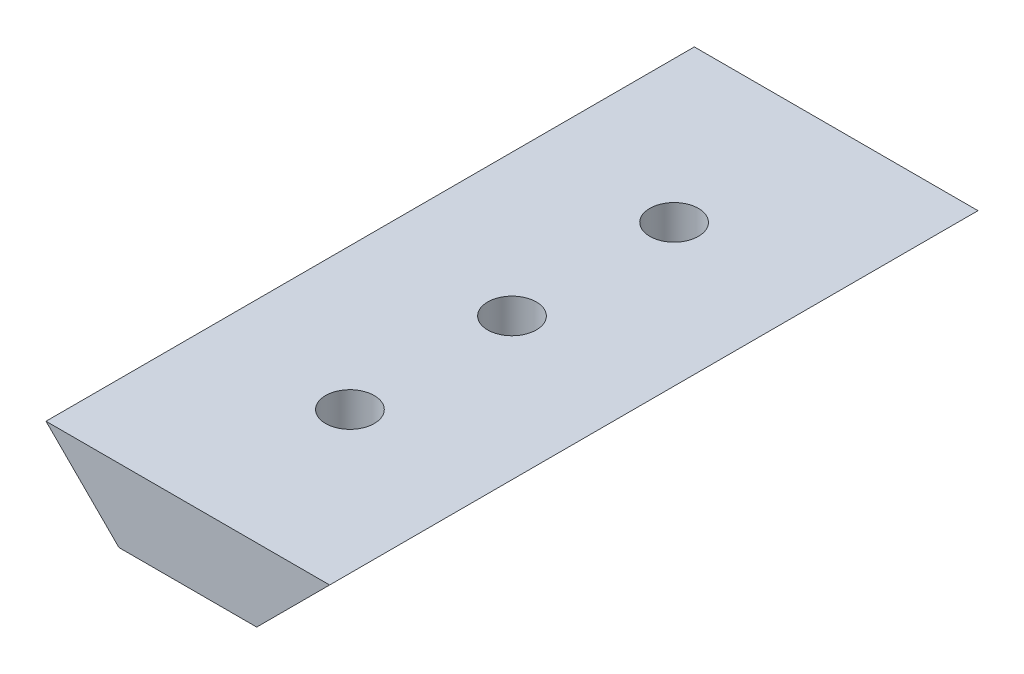
ISO-10303-21;
HEADER;
FILE_DESCRIPTION(('STEP AP214'),'2;1');
FILE_NAME('part.step','',(''),(''),'','','');
FILE_SCHEMA(('AUTOMOTIVE_DESIGN { 1 0 10303 214 1 1 1 1 }'));
ENDSEC;
DATA;
#1=APPLICATION_CONTEXT('core data for automotive mechanical design processes');
#2=APPLICATION_PROTOCOL_DEFINITION('international standard','automotive_design',2000,#1);
#3=PRODUCT_CONTEXT('',#1,'mechanical');
#4=PRODUCT('Part','Part','',(#3));
#5=PRODUCT_RELATED_PRODUCT_CATEGORY('part','',(#4));
#6=PRODUCT_DEFINITION_FORMATION('','',#4);
#7=PRODUCT_DEFINITION_CONTEXT('part definition',#1,'design');
#8=PRODUCT_DEFINITION('design','',#6,#7);
#9=PRODUCT_DEFINITION_SHAPE('','',#8);
#10=(LENGTH_UNIT() NAMED_UNIT(*) SI_UNIT(.MILLI.,.METRE.));
#11=(NAMED_UNIT(*) PLANE_ANGLE_UNIT() SI_UNIT($,.RADIAN.));
#12=(NAMED_UNIT(*) SI_UNIT($,.STERADIAN.) SOLID_ANGLE_UNIT());
#13=UNCERTAINTY_MEASURE_WITH_UNIT(LENGTH_MEASURE(1.E-05),#10,'distance_accuracy_value','');
#14=(GEOMETRIC_REPRESENTATION_CONTEXT(3) GLOBAL_UNCERTAINTY_ASSIGNED_CONTEXT((#13)) GLOBAL_UNIT_ASSIGNED_CONTEXT((#10,
#11,#12)) REPRESENTATION_CONTEXT('',''));
#15=CARTESIAN_POINT('',(0.,0.,0.));
#16=DIRECTION('',(0.,0.,1.));
#17=DIRECTION('',(1.,0.,0.));
#18=AXIS2_PLACEMENT_3D('',#15,#16,#17);
#19=CARTESIAN_POINT('',(-8.75,2.25,40.));
#20=DIRECTION('',(0.707106781186547,0.707106781186548,0.));
#21=DIRECTION('',(-0.707106781186548,0.707106781186547,0.));
#22=AXIS2_PLACEMENT_3D('',#19,#20,#21);
#23=PLANE('',#22);
#24=DIRECTION('',(0.707106781186548,-0.707106781186547,0.));
#25=VECTOR('',#24,1.);
#26=CARTESIAN_POINT('',(-8.75,2.25,0.));
#27=LINE('',#26,#25);
#28=CARTESIAN_POINT('',(-8.75,2.25,0.));
#29=VERTEX_POINT('',#28);
#30=CARTESIAN_POINT('',(-4.25,-2.25,0.));
#31=VERTEX_POINT('',#30);
#32=EDGE_CURVE('E94',#29,#31,#27,.T.);
#33=ORIENTED_EDGE('',*,*,#32,.T.);
#34=DIRECTION('',(0.,0.,-1.));
#35=VECTOR('',#34,1.);
#36=CARTESIAN_POINT('',(-4.25,-2.25,40.));
#37=LINE('',#36,#35);
#38=CARTESIAN_POINT('',(-4.25,-2.25,40.));
#39=VERTEX_POINT('',#38);
#40=EDGE_CURVE('E11',#39,#31,#37,.T.);
#41=ORIENTED_EDGE('',*,*,#40,.F.);
#42=DIRECTION('',(0.707106781186548,-0.707106781186547,0.));
#43=VECTOR('',#42,1.);
#44=CARTESIAN_POINT('',(-8.75,2.25,40.));
#45=LINE('',#44,#43);
#46=CARTESIAN_POINT('',(-8.75,2.25,40.));
#47=VERTEX_POINT('',#46);
#48=EDGE_CURVE('E82',#47,#39,#45,.T.);
#49=ORIENTED_EDGE('',*,*,#48,.F.);
#50=DIRECTION('',(0.,0.,-1.));
#51=VECTOR('',#50,1.);
#52=CARTESIAN_POINT('',(-8.75,2.25,40.));
#53=LINE('',#52,#51);
#54=EDGE_CURVE('E90',#47,#29,#53,.T.);
#55=ORIENTED_EDGE('',*,*,#54,.T.);
#56=EDGE_LOOP('',(#33,#41,#49,#55));
#57=FACE_BOUND('',#56,.T.);
#58=ADVANCED_FACE('F31',(#57),#23,.F.);
#59=CARTESIAN_POINT('',(-4.25,-2.25,40.));
#60=DIRECTION('',(0.,1.,0.));
#61=DIRECTION('',(-1.,0.,0.));
#62=AXIS2_PLACEMENT_3D('',#59,#60,#61);
#63=PLANE('',#62);
#64=CARTESIAN_POINT('',(0.,-2.25,30.));
#65=DIRECTION('',(0.,1.,0.));
#66=DIRECTION('',(-1.,0.,0.));
#67=AXIS2_PLACEMENT_3D('',#64,#65,#66);
#68=CIRCLE('',#67,1.5);
#69=CARTESIAN_POINT('',(-1.5,-2.25,30.));
#70=VERTEX_POINT('',#69);
#71=EDGE_CURVE('E119',#70,#70,#68,.F.);
#72=ORIENTED_EDGE('',*,*,#71,.F.);
#73=EDGE_LOOP('',(#72));
#74=FACE_BOUND('',#73,.T.);
#75=CARTESIAN_POINT('',(0.,-2.25,10.));
#76=DIRECTION('',(0.,1.,0.));
#77=DIRECTION('',(-1.,0.,0.));
#78=AXIS2_PLACEMENT_3D('',#75,#76,#77);
#79=CIRCLE('',#78,1.5);
#80=CARTESIAN_POINT('',(-1.5,-2.25,10.));
#81=VERTEX_POINT('',#80);
#82=EDGE_CURVE('E113',#81,#81,#79,.F.);
#83=ORIENTED_EDGE('',*,*,#82,.F.);
#84=EDGE_LOOP('',(#83));
#85=FACE_BOUND('',#84,.T.);
#86=CARTESIAN_POINT('',(0.,-2.25,20.));
#87=DIRECTION('',(0.,1.,0.));
#88=DIRECTION('',(-1.,0.,0.));
#89=AXIS2_PLACEMENT_3D('',#86,#87,#88);
#90=CIRCLE('',#89,1.5);
#91=CARTESIAN_POINT('',(-1.5,-2.25,20.));
#92=VERTEX_POINT('',#91);
#93=EDGE_CURVE('E97',#92,#92,#90,.F.);
#94=ORIENTED_EDGE('',*,*,#93,.F.);
#95=EDGE_LOOP('',(#94));
#96=FACE_BOUND('',#95,.T.);
#97=DIRECTION('',(1.,0.,0.));
#98=VECTOR('',#97,1.);
#99=CARTESIAN_POINT('',(-4.25,-2.25,0.));
#100=LINE('',#99,#98);
#101=CARTESIAN_POINT('',(4.25,-2.25,0.));
#102=VERTEX_POINT('',#101);
#103=EDGE_CURVE('E86',#31,#102,#100,.T.);
#104=ORIENTED_EDGE('',*,*,#103,.T.);
#105=DIRECTION('',(0.,0.,-1.));
#106=VECTOR('',#105,1.);
#107=CARTESIAN_POINT('',(4.25,-2.25,40.));
#108=LINE('',#107,#106);
#109=CARTESIAN_POINT('',(4.25,-2.25,40.));
#110=VERTEX_POINT('',#109);
#111=EDGE_CURVE('E39',#110,#102,#108,.T.);
#112=ORIENTED_EDGE('',*,*,#111,.F.);
#113=DIRECTION('',(1.,0.,0.));
#114=VECTOR('',#113,1.);
#115=CARTESIAN_POINT('',(-4.25,-2.25,40.));
#116=LINE('',#115,#114);
#117=EDGE_CURVE('E77',#39,#110,#116,.T.);
#118=ORIENTED_EDGE('',*,*,#117,.F.);
#119=ORIENTED_EDGE('',*,*,#40,.T.);
#120=EDGE_LOOP('',(#104,#112,#118,#119));
#121=FACE_BOUND('',#120,.T.);
#122=ADVANCED_FACE('F85',(#74,#85,#96,#121),#63,.F.);
#123=CARTESIAN_POINT('',(8.75,2.24999999999999,40.));
#124=DIRECTION('',(-0.707106781186547,0.707106781186548,0.));
#125=DIRECTION('',(-0.707106781186548,-0.707106781186547,0.));
#126=AXIS2_PLACEMENT_3D('',#123,#124,#125);
#127=PLANE('',#126);
#128=DIRECTION('',(0.707106781186548,0.707106781186547,0.));
#129=VECTOR('',#128,1.);
#130=CARTESIAN_POINT('',(8.75,2.24999999999999,0.));
#131=LINE('',#130,#129);
#132=CARTESIAN_POINT('',(8.75,2.24999999999999,0.));
#133=VERTEX_POINT('',#132);
#134=EDGE_CURVE('E64',#102,#133,#131,.T.);
#135=ORIENTED_EDGE('',*,*,#134,.T.);
#136=DIRECTION('',(0.,0.,-1.));
#137=VECTOR('',#136,1.);
#138=CARTESIAN_POINT('',(8.75,2.24999999999999,40.));
#139=LINE('',#138,#137);
#140=CARTESIAN_POINT('',(8.75,2.24999999999999,40.));
#141=VERTEX_POINT('',#140);
#142=EDGE_CURVE('E87',#141,#133,#139,.T.);
#143=ORIENTED_EDGE('',*,*,#142,.F.);
#144=DIRECTION('',(0.707106781186548,0.707106781186547,0.));
#145=VECTOR('',#144,1.);
#146=CARTESIAN_POINT('',(8.75,2.24999999999999,40.));
#147=LINE('',#146,#145);
#148=EDGE_CURVE('E80',#110,#141,#147,.T.);
#149=ORIENTED_EDGE('',*,*,#148,.F.);
#150=ORIENTED_EDGE('',*,*,#111,.T.);
#151=EDGE_LOOP('',(#135,#143,#149,#150));
#152=FACE_BOUND('',#151,.T.);
#153=ADVANCED_FACE('F88',(#152),#127,.F.);
#154=CARTESIAN_POINT('',(-8.75,2.25,40.));
#155=DIRECTION('',(0.,-1.,0.));
#156=DIRECTION('',(1.,0.,0.));
#157=AXIS2_PLACEMENT_3D('',#154,#155,#156);
#158=PLANE('',#157);
#159=CARTESIAN_POINT('',(0.,2.25,30.));
#160=DIRECTION('',(0.,1.,0.));
#161=DIRECTION('',(-1.,0.,0.));
#162=AXIS2_PLACEMENT_3D('',#159,#160,#161);
#163=CIRCLE('',#162,1.5);
#164=CARTESIAN_POINT('',(-1.5,2.25,30.));
#165=VERTEX_POINT('',#164);
#166=EDGE_CURVE('E122',#165,#165,#163,.T.);
#167=ORIENTED_EDGE('',*,*,#166,.F.);
#168=EDGE_LOOP('',(#167));
#169=FACE_BOUND('',#168,.T.);
#170=CARTESIAN_POINT('',(0.,2.25,10.));
#171=DIRECTION('',(0.,1.,0.));
#172=DIRECTION('',(-1.,0.,0.));
#173=AXIS2_PLACEMENT_3D('',#170,#171,#172);
#174=CIRCLE('',#173,1.5);
#175=CARTESIAN_POINT('',(-1.5,2.25,10.));
#176=VERTEX_POINT('',#175);
#177=EDGE_CURVE('E116',#176,#176,#174,.T.);
#178=ORIENTED_EDGE('',*,*,#177,.F.);
#179=EDGE_LOOP('',(#178));
#180=FACE_BOUND('',#179,.T.);
#181=CARTESIAN_POINT('',(0.,2.25,20.));
#182=DIRECTION('',(0.,1.,0.));
#183=DIRECTION('',(-1.,0.,0.));
#184=AXIS2_PLACEMENT_3D('',#181,#182,#183);
#185=CIRCLE('',#184,1.5);
#186=CARTESIAN_POINT('',(-1.5,2.25,20.));
#187=VERTEX_POINT('',#186);
#188=EDGE_CURVE('E110',#187,#187,#185,.T.);
#189=ORIENTED_EDGE('',*,*,#188,.F.);
#190=EDGE_LOOP('',(#189));
#191=FACE_BOUND('',#190,.T.);
#192=DIRECTION('',(-1.,0.,0.));
#193=VECTOR('',#192,1.);
#194=CARTESIAN_POINT('',(-8.75,2.25,0.));
#195=LINE('',#194,#193);
#196=EDGE_CURVE('E70',#133,#29,#195,.T.);
#197=ORIENTED_EDGE('',*,*,#196,.T.);
#198=ORIENTED_EDGE('',*,*,#54,.F.);
#199=DIRECTION('',(-1.,0.,0.));
#200=VECTOR('',#199,1.);
#201=CARTESIAN_POINT('',(-8.75,2.25,40.));
#202=LINE('',#201,#200);
#203=EDGE_CURVE('E47',#141,#47,#202,.T.);
#204=ORIENTED_EDGE('',*,*,#203,.F.);
#205=ORIENTED_EDGE('',*,*,#142,.T.);
#206=EDGE_LOOP('',(#197,#198,#204,#205));
#207=FACE_BOUND('',#206,.T.);
#208=ADVANCED_FACE('F102',(#169,#180,#191,#207),#158,.F.);
#209=CARTESIAN_POINT('',(0.,-6.49999999999999,40.));
#210=DIRECTION('',(0.,0.,-1.));
#211=DIRECTION('',(-1.,0.,0.));
#212=AXIS2_PLACEMENT_3D('',#209,#210,#211);
#213=PLANE('',#212);
#214=ORIENTED_EDGE('',*,*,#48,.T.);
#215=ORIENTED_EDGE('',*,*,#117,.T.);
#216=ORIENTED_EDGE('',*,*,#148,.T.);
#217=ORIENTED_EDGE('',*,*,#203,.T.);
#218=EDGE_LOOP('',(#214,#215,#216,#217));
#219=FACE_BOUND('',#218,.T.);
#220=ADVANCED_FACE('F78',(#219),#213,.F.);
#221=CARTESIAN_POINT('',(0.,-6.49999999999999,0.));
#222=DIRECTION('',(0.,0.,-1.));
#223=DIRECTION('',(-1.,0.,0.));
#224=AXIS2_PLACEMENT_3D('',#221,#222,#223);
#225=PLANE('',#224);
#226=ORIENTED_EDGE('',*,*,#32,.F.);
#227=ORIENTED_EDGE('',*,*,#196,.F.);
#228=ORIENTED_EDGE('',*,*,#134,.F.);
#229=ORIENTED_EDGE('',*,*,#103,.F.);
#230=EDGE_LOOP('',(#226,#227,#228,#229));
#231=FACE_BOUND('',#230,.T.);
#232=ADVANCED_FACE('F105',(#231),#225,.T.);
#233=CARTESIAN_POINT('',(0.,-2.25100000000001,20.));
#234=DIRECTION('',(0.,1.,0.));
#235=DIRECTION('',(-1.,0.,0.));
#236=AXIS2_PLACEMENT_3D('',#233,#234,#235);
#237=CYLINDRICAL_SURFACE('',#236,1.5);
#238=ORIENTED_EDGE('',*,*,#188,.T.);
#239=EDGE_LOOP('',(#238));
#240=FACE_BOUND('',#239,.T.);
#241=ORIENTED_EDGE('',*,*,#93,.T.);
#242=EDGE_LOOP('',(#241));
#243=FACE_BOUND('',#242,.T.);
#244=ADVANCED_FACE('F136',(#240,#243),#237,.F.);
#245=CARTESIAN_POINT('',(0.,-2.25100000000001,10.));
#246=DIRECTION('',(0.,1.,0.));
#247=DIRECTION('',(-1.,0.,0.));
#248=AXIS2_PLACEMENT_3D('',#245,#246,#247);
#249=CYLINDRICAL_SURFACE('',#248,1.5);
#250=ORIENTED_EDGE('',*,*,#177,.T.);
#251=EDGE_LOOP('',(#250));
#252=FACE_BOUND('',#251,.T.);
#253=ORIENTED_EDGE('',*,*,#82,.T.);
#254=EDGE_LOOP('',(#253));
#255=FACE_BOUND('',#254,.T.);
#256=ADVANCED_FACE('F139',(#252,#255),#249,.F.);
#257=CARTESIAN_POINT('',(0.,-2.25100000000001,30.));
#258=DIRECTION('',(0.,1.,0.));
#259=DIRECTION('',(-1.,0.,0.));
#260=AXIS2_PLACEMENT_3D('',#257,#258,#259);
#261=CYLINDRICAL_SURFACE('',#260,1.5);
#262=ORIENTED_EDGE('',*,*,#166,.T.);
#263=EDGE_LOOP('',(#262));
#264=FACE_BOUND('',#263,.T.);
#265=ORIENTED_EDGE('',*,*,#71,.T.);
#266=EDGE_LOOP('',(#265));
#267=FACE_BOUND('',#266,.T.);
#268=ADVANCED_FACE('F126',(#264,#267),#261,.F.);
#269=CLOSED_SHELL('',(#58,#122,#153,#208,#220,#232,#244,#256,#268));
#270=MANIFOLD_SOLID_BREP('B2',#269);
#271=ADVANCED_BREP_SHAPE_REPRESENTATION('',(#18,#270),#14);
#272=SHAPE_DEFINITION_REPRESENTATION(#9,#271);
ENDSEC;
END-ISO-10303-21;
